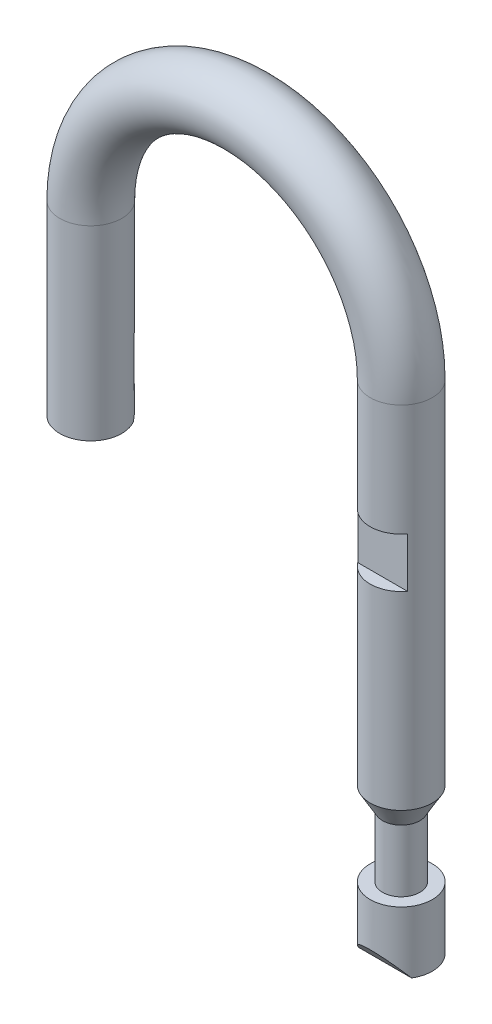
ISO-10303-21;
HEADER;
FILE_DESCRIPTION(('STEP AP214'),'2;1');
FILE_NAME('part.step','',(''),(''),'','','');
FILE_SCHEMA(('AUTOMOTIVE_DESIGN { 1 0 10303 214 1 1 1 1 }'));
ENDSEC;
DATA;
#1=APPLICATION_CONTEXT('core data for automotive mechanical design processes');
#2=APPLICATION_PROTOCOL_DEFINITION('international standard','automotive_design',2000,#1);
#3=PRODUCT_CONTEXT('',#1,'mechanical');
#4=PRODUCT('Part','Part','',(#3));
#5=PRODUCT_RELATED_PRODUCT_CATEGORY('part','',(#4));
#6=PRODUCT_DEFINITION_FORMATION('','',#4);
#7=PRODUCT_DEFINITION_CONTEXT('part definition',#1,'design');
#8=PRODUCT_DEFINITION('design','',#6,#7);
#9=PRODUCT_DEFINITION_SHAPE('','',#8);
#10=(LENGTH_UNIT() NAMED_UNIT(*) SI_UNIT(.MILLI.,.METRE.));
#11=(NAMED_UNIT(*) PLANE_ANGLE_UNIT() SI_UNIT($,.RADIAN.));
#12=(NAMED_UNIT(*) SI_UNIT($,.STERADIAN.) SOLID_ANGLE_UNIT());
#13=UNCERTAINTY_MEASURE_WITH_UNIT(LENGTH_MEASURE(1.E-05),#10,'distance_accuracy_value','');
#14=(GEOMETRIC_REPRESENTATION_CONTEXT(3) GLOBAL_UNCERTAINTY_ASSIGNED_CONTEXT((#13)) GLOBAL_UNIT_ASSIGNED_CONTEXT((#10,
#11,#12)) REPRESENTATION_CONTEXT('',''));
#15=CARTESIAN_POINT('',(0.,0.,0.));
#16=DIRECTION('',(0.,0.,1.));
#17=DIRECTION('',(1.,0.,0.));
#18=AXIS2_PLACEMENT_3D('',#15,#16,#17);
#19=CARTESIAN_POINT('',(32.5,5.,0.));
#20=DIRECTION('',(0.,-1.,0.));
#21=DIRECTION('',(1.,0.,0.));
#22=AXIS2_PLACEMENT_3D('',#19,#20,#21);
#23=CYLINDRICAL_SURFACE('',#22,2.5);
#24=CARTESIAN_POINT('',(32.5,-23.2679491924311,0.));
#25=DIRECTION('',(0.,-1.,0.));
#26=DIRECTION('',(0.,0.,-1.));
#27=AXIS2_PLACEMENT_3D('',#24,#25,#26);
#28=CIRCLE('',#27,2.5);
#29=CARTESIAN_POINT('',(32.5,-23.2679491924311,-2.5));
#30=VERTEX_POINT('',#29);
#31=EDGE_CURVE('E11',#30,#30,#28,.F.);
#32=ORIENTED_EDGE('',*,*,#31,.T.);
#33=EDGE_LOOP('',(#32));
#34=FACE_BOUND('',#33,.T.);
#35=DIRECTION('',(0.,-1.,0.));
#36=VECTOR('',#35,1.);
#37=CARTESIAN_POINT('',(34.5,5.,1.5));
#38=LINE('',#37,#36);
#39=CARTESIAN_POINT('',(34.5,-8.,1.5));
#40=VERTEX_POINT('',#39);
#41=CARTESIAN_POINT('',(34.5,-4.,1.5));
#42=VERTEX_POINT('',#41);
#43=EDGE_CURVE('E55',#40,#42,#38,.F.);
#44=ORIENTED_EDGE('',*,*,#43,.F.);
#45=CARTESIAN_POINT('',(32.5,-8.,0.));
#46=DIRECTION('',(0.,-1.,0.));
#47=DIRECTION('',(0.,0.,-1.));
#48=AXIS2_PLACEMENT_3D('',#45,#46,#47);
#49=CIRCLE('',#48,2.5);
#50=CARTESIAN_POINT('',(30.5,-8.,1.5));
#51=VERTEX_POINT('',#50);
#52=EDGE_CURVE('E146',#51,#40,#49,.F.);
#53=ORIENTED_EDGE('',*,*,#52,.F.);
#54=DIRECTION('',(0.,-1.,0.));
#55=VECTOR('',#54,1.);
#56=CARTESIAN_POINT('',(30.5,5.,1.5));
#57=LINE('',#56,#55);
#58=CARTESIAN_POINT('',(30.5,-4.,1.5));
#59=VERTEX_POINT('',#58);
#60=EDGE_CURVE('E107',#59,#51,#57,.T.);
#61=ORIENTED_EDGE('',*,*,#60,.F.);
#62=CARTESIAN_POINT('',(32.5,-4.00000000000001,0.));
#63=DIRECTION('',(0.,-1.,0.));
#64=DIRECTION('',(0.,0.,-1.));
#65=AXIS2_PLACEMENT_3D('',#62,#63,#64);
#66=CIRCLE('',#65,2.5);
#67=EDGE_CURVE('E149',#59,#42,#66,.F.);
#68=ORIENTED_EDGE('',*,*,#67,.T.);
#69=EDGE_LOOP('',(#44,#53,#61,#68));
#70=FACE_BOUND('',#69,.T.);
#71=CARTESIAN_POINT('',(32.5,5.,0.));
#72=DIRECTION('',(0.,-1.,0.));
#73=DIRECTION('',(0.,0.,1.));
#74=AXIS2_PLACEMENT_3D('',#71,#72,#73);
#75=CIRCLE('',#74,2.5);
#76=CARTESIAN_POINT('',(35.,5.,0.));
#77=VERTEX_POINT('',#76);
#78=EDGE_CURVE('E119',#77,#77,#75,.T.);
#79=ORIENTED_EDGE('',*,*,#78,.T.);
#80=EDGE_LOOP('',(#79));
#81=FACE_BOUND('',#80,.T.);
#82=ADVANCED_FACE('F45',(#34,#70,#81),#23,.T.);
#83=CARTESIAN_POINT('',(7.49999999999999,-10.,0.));
#84=DIRECTION('',(0.,1.,0.));
#85=DIRECTION('',(0.,0.,1.));
#86=AXIS2_PLACEMENT_3D('',#83,#84,#85);
#87=PLANE('',#86);
#88=DIRECTION('',(-1.,0.,0.));
#89=VECTOR('',#88,1.);
#90=CARTESIAN_POINT('',(10.,-10.,-1.3));
#91=LINE('',#90,#89);
#92=CARTESIAN_POINT('',(9.63541565040626,-10.,-1.3));
#93=VERTEX_POINT('',#92);
#94=CARTESIAN_POINT('',(5.36458434959373,-10.,-1.3));
#95=VERTEX_POINT('',#94);
#96=EDGE_CURVE('E169',#93,#95,#91,.T.);
#97=ORIENTED_EDGE('',*,*,#96,.F.);
#98=CARTESIAN_POINT('',(7.49999999999999,-10.,0.));
#99=DIRECTION('',(0.,1.,0.));
#100=DIRECTION('',(0.,0.,1.));
#101=AXIS2_PLACEMENT_3D('',#98,#99,#100);
#102=CIRCLE('',#101,2.5);
#103=EDGE_CURVE('E181',#95,#93,#102,.T.);
#104=ORIENTED_EDGE('',*,*,#103,.F.);
#105=EDGE_LOOP('',(#97,#104));
#106=FACE_BOUND('',#105,.T.);
#107=ADVANCED_FACE('F194',(#106),#87,.F.);
#108=CARTESIAN_POINT('',(7.49999999999999,-10.,0.));
#109=DIRECTION('',(0.,1.,0.));
#110=DIRECTION('',(-1.,0.,0.));
#111=AXIS2_PLACEMENT_3D('',#108,#109,#110);
#112=CYLINDRICAL_SURFACE('',#111,2.5);
#113=CARTESIAN_POINT('',(7.49999999999998,5.,0.));
#114=DIRECTION('',(0.,1.,0.));
#115=DIRECTION('',(0.,0.,1.));
#116=AXIS2_PLACEMENT_3D('',#113,#114,#115);
#117=CIRCLE('',#116,2.5);
#118=CARTESIAN_POINT('',(4.99999999999999,5.,0.));
#119=VERTEX_POINT('',#118);
#120=EDGE_CURVE('E126',#119,#119,#117,.T.);
#121=ORIENTED_EDGE('',*,*,#120,.F.);
#122=EDGE_LOOP('',(#121));
#123=FACE_BOUND('',#122,.T.);
#124=CARTESIAN_POINT('',(7.5,-11.625,0.));
#125=DIRECTION('',(0.,-0.624695047554424,-0.780868809443031));
#126=DIRECTION('',(0.,0.78086880944303,-0.624695047554424));
#127=AXIS2_PLACEMENT_3D('',#124,#125,#126);
#128=ELLIPSE('',#127,4.00195264839553,2.5);
#129=EDGE_CURVE('E118',#93,#95,#128,.F.);
#130=ORIENTED_EDGE('',*,*,#129,.T.);
#131=ORIENTED_EDGE('',*,*,#103,.T.);
#132=EDGE_LOOP('',(#130,#131));
#133=FACE_BOUND('',#132,.T.);
#134=CARTESIAN_POINT('',(7.49999999999999,-4.,0.));
#135=DIRECTION('',(0.,-1.,0.));
#136=DIRECTION('',(0.,0.,-1.));
#137=AXIS2_PLACEMENT_3D('',#134,#135,#136);
#138=CIRCLE('',#137,2.5);
#139=CARTESIAN_POINT('',(9.49999999999999,-4.,-1.5));
#140=VERTEX_POINT('',#139);
#141=CARTESIAN_POINT('',(5.49999999999999,-4.,-1.5));
#142=VERTEX_POINT('',#141);
#143=EDGE_CURVE('E133',#140,#142,#138,.F.);
#144=ORIENTED_EDGE('',*,*,#143,.T.);
#145=DIRECTION('',(0.,1.,0.));
#146=VECTOR('',#145,1.);
#147=CARTESIAN_POINT('',(5.5,-10.,-1.5));
#148=LINE('',#147,#146);
#149=CARTESIAN_POINT('',(5.49999999999999,-8.,-1.5));
#150=VERTEX_POINT('',#149);
#151=EDGE_CURVE('E108',#142,#150,#148,.F.);
#152=ORIENTED_EDGE('',*,*,#151,.T.);
#153=CARTESIAN_POINT('',(7.49999999999999,-8.,0.));
#154=DIRECTION('',(0.,1.,0.));
#155=DIRECTION('',(0.,0.,1.));
#156=AXIS2_PLACEMENT_3D('',#153,#154,#155);
#157=CIRCLE('',#156,2.5);
#158=CARTESIAN_POINT('',(9.49999999999999,-8.,-1.5));
#159=VERTEX_POINT('',#158);
#160=EDGE_CURVE('E137',#150,#159,#157,.F.);
#161=ORIENTED_EDGE('',*,*,#160,.T.);
#162=DIRECTION('',(0.,1.,0.));
#163=VECTOR('',#162,1.);
#164=CARTESIAN_POINT('',(9.49999999999999,-10.,-1.5));
#165=LINE('',#164,#163);
#166=EDGE_CURVE('E123',#159,#140,#165,.T.);
#167=ORIENTED_EDGE('',*,*,#166,.T.);
#168=EDGE_LOOP('',(#144,#152,#161,#167));
#169=FACE_BOUND('',#168,.T.);
#170=ADVANCED_FACE('F191',(#123,#133,#169),#112,.T.);
#171=CARTESIAN_POINT('',(20.,5.,0.));
#172=DIRECTION('',(0.,0.,-1.));
#173=DIRECTION('',(-1.,0.,0.));
#174=AXIS2_PLACEMENT_3D('',#171,#172,#173);
#175=TOROIDAL_SURFACE('',#174,12.5,2.5);
#176=CARTESIAN_POINT('',(20.,5.,0.));
#177=DIRECTION('',(0.,0.,-1.));
#178=DIRECTION('',(-1.,0.,0.));
#179=AXIS2_PLACEMENT_3D('',#176,#177,#178);
#180=CIRCLE('',#179,15.);
#181=EDGE_CURVE('',#119,#77,#180,.T.);
#182=ORIENTED_EDGE('',*,*,#120,.T.);
#183=ORIENTED_EDGE('',*,*,#78,.F.);
#184=ORIENTED_EDGE('',*,*,#181,.T.);
#185=ORIENTED_EDGE('',*,*,#181,.F.);
#186=EDGE_LOOP('',(#182,#184,#183,#185));
#187=FACE_BOUND('',#186,.T.);
#188=ADVANCED_FACE('F189',(#187),#175,.T.);
#189=CARTESIAN_POINT('',(10.,-4.53658536585366,-5.67073170731708));
#190=DIRECTION('',(0.,-0.624695047554424,-0.780868809443031));
#191=DIRECTION('',(0.,0.780868809443031,-0.624695047554424));
#192=AXIS2_PLACEMENT_3D('',#189,#190,#191);
#193=PLANE('',#192);
#194=ORIENTED_EDGE('',*,*,#129,.F.);
#195=ORIENTED_EDGE('',*,*,#96,.T.);
#196=EDGE_LOOP('',(#194,#195));
#197=FACE_BOUND('',#196,.T.);
#198=ADVANCED_FACE('F208',(#197),#193,.T.);
#199=CARTESIAN_POINT('',(10.,-8.,0.));
#200=DIRECTION('',(0.,1.,0.));
#201=DIRECTION('',(0.,0.,1.));
#202=AXIS2_PLACEMENT_3D('',#199,#200,#201);
#203=PLANE('',#202);
#204=DIRECTION('',(-1.,0.,0.));
#205=VECTOR('',#204,1.);
#206=CARTESIAN_POINT('',(10.,-8.,-1.5));
#207=LINE('',#206,#205);
#208=EDGE_CURVE('E173',#159,#150,#207,.T.);
#209=ORIENTED_EDGE('',*,*,#208,.F.);
#210=ORIENTED_EDGE('',*,*,#160,.F.);
#211=EDGE_LOOP('',(#209,#210));
#212=FACE_BOUND('',#211,.T.);
#213=ADVANCED_FACE('F201',(#212),#203,.T.);
#214=CARTESIAN_POINT('',(10.,-4.,0.));
#215=DIRECTION('',(0.,-1.,0.));
#216=DIRECTION('',(0.,0.,-1.));
#217=AXIS2_PLACEMENT_3D('',#214,#215,#216);
#218=PLANE('',#217);
#219=DIRECTION('',(-1.,0.,0.));
#220=VECTOR('',#219,1.);
#221=CARTESIAN_POINT('',(10.,-4.,-1.5));
#222=LINE('',#221,#220);
#223=EDGE_CURVE('E70',#140,#142,#222,.T.);
#224=ORIENTED_EDGE('',*,*,#223,.T.);
#225=ORIENTED_EDGE('',*,*,#143,.F.);
#226=EDGE_LOOP('',(#224,#225));
#227=FACE_BOUND('',#226,.T.);
#228=ADVANCED_FACE('F198',(#227),#218,.T.);
#229=CARTESIAN_POINT('',(10.,0.,-1.5));
#230=DIRECTION('',(0.,0.,-1.));
#231=DIRECTION('',(0.,1.,0.));
#232=AXIS2_PLACEMENT_3D('',#229,#230,#231);
#233=PLANE('',#232);
#234=ORIENTED_EDGE('',*,*,#223,.F.);
#235=ORIENTED_EDGE('',*,*,#166,.F.);
#236=ORIENTED_EDGE('',*,*,#208,.T.);
#237=ORIENTED_EDGE('',*,*,#151,.F.);
#238=EDGE_LOOP('',(#234,#235,#236,#237));
#239=FACE_BOUND('',#238,.T.);
#240=ADVANCED_FACE('F200',(#239),#233,.T.);
#241=CARTESIAN_POINT('',(35.,-4.,0.));
#242=DIRECTION('',(0.,-1.,0.));
#243=DIRECTION('',(0.,0.,-1.));
#244=AXIS2_PLACEMENT_3D('',#241,#242,#243);
#245=PLANE('',#244);
#246=DIRECTION('',(-1.,0.,0.));
#247=VECTOR('',#246,1.);
#248=CARTESIAN_POINT('',(35.,-4.,1.5));
#249=LINE('',#248,#247);
#250=EDGE_CURVE('E62',#42,#59,#249,.T.);
#251=ORIENTED_EDGE('',*,*,#250,.F.);
#252=ORIENTED_EDGE('',*,*,#67,.F.);
#253=EDGE_LOOP('',(#251,#252));
#254=FACE_BOUND('',#253,.T.);
#255=ADVANCED_FACE('F161',(#254),#245,.T.);
#256=CARTESIAN_POINT('',(35.,-8.,0.));
#257=DIRECTION('',(0.,-1.,0.));
#258=DIRECTION('',(0.,0.,-1.));
#259=AXIS2_PLACEMENT_3D('',#256,#257,#258);
#260=PLANE('',#259);
#261=ORIENTED_EDGE('',*,*,#52,.T.);
#262=DIRECTION('',(-1.,0.,0.));
#263=VECTOR('',#262,1.);
#264=CARTESIAN_POINT('',(35.,-8.,1.5));
#265=LINE('',#264,#263);
#266=EDGE_CURVE('E157',#40,#51,#265,.T.);
#267=ORIENTED_EDGE('',*,*,#266,.T.);
#268=EDGE_LOOP('',(#261,#267));
#269=FACE_BOUND('',#268,.T.);
#270=ADVANCED_FACE('F167',(#269),#260,.F.);
#271=CARTESIAN_POINT('',(35.,0.,1.5));
#272=DIRECTION('',(0.,0.,-1.));
#273=DIRECTION('',(0.,1.,0.));
#274=AXIS2_PLACEMENT_3D('',#271,#272,#273);
#275=PLANE('',#274);
#276=ORIENTED_EDGE('',*,*,#43,.T.);
#277=ORIENTED_EDGE('',*,*,#250,.T.);
#278=ORIENTED_EDGE('',*,*,#60,.T.);
#279=ORIENTED_EDGE('',*,*,#266,.F.);
#280=EDGE_LOOP('',(#276,#277,#278,#279));
#281=FACE_BOUND('',#280,.T.);
#282=ADVANCED_FACE('F155',(#281),#275,.F.);
#283=CARTESIAN_POINT('',(32.5,-30.,0.));
#284=DIRECTION('',(0.,-1.,0.));
#285=DIRECTION('',(1.,0.,0.));
#286=AXIS2_PLACEMENT_3D('',#283,#284,#285);
#287=PLANE('',#286);
#288=CARTESIAN_POINT('',(32.5,-30.,0.));
#289=DIRECTION('',(0.,-1.,0.));
#290=DIRECTION('',(1.,0.,0.));
#291=AXIS2_PLACEMENT_3D('',#288,#289,#290);
#292=CIRCLE('',#291,1.5);
#293=CARTESIAN_POINT('',(34.,-30.,0.));
#294=VERTEX_POINT('',#293);
#295=EDGE_CURVE('E235',#294,#294,#292,.T.);
#296=ORIENTED_EDGE('',*,*,#295,.T.);
#297=EDGE_LOOP('',(#296));
#298=FACE_BOUND('',#297,.T.);
#299=CARTESIAN_POINT('',(32.5,-30.,0.));
#300=DIRECTION('',(0.,-1.,0.));
#301=DIRECTION('',(1.,0.,0.));
#302=AXIS2_PLACEMENT_3D('',#299,#300,#301);
#303=CIRCLE('',#302,2.5);
#304=CARTESIAN_POINT('',(35.,-30.,0.));
#305=VERTEX_POINT('',#304);
#306=EDGE_CURVE('E114',#305,#305,#303,.T.);
#307=ORIENTED_EDGE('',*,*,#306,.F.);
#308=EDGE_LOOP('',(#307));
#309=FACE_BOUND('',#308,.T.);
#310=ADVANCED_FACE('F242',(#298,#309),#287,.F.);
#311=CARTESIAN_POINT('',(32.5,-25.,0.));
#312=DIRECTION('',(0.,-1.,0.));
#313=DIRECTION('',(1.,0.,0.));
#314=AXIS2_PLACEMENT_3D('',#311,#312,#313);
#315=CYLINDRICAL_SURFACE('',#314,1.5);
#316=CARTESIAN_POINT('',(32.5,-25.,0.));
#317=DIRECTION('',(0.,-1.,0.));
#318=DIRECTION('',(1.,0.,0.));
#319=AXIS2_PLACEMENT_3D('',#316,#317,#318);
#320=CIRCLE('',#319,1.5);
#321=CARTESIAN_POINT('',(34.,-25.,0.));
#322=VERTEX_POINT('',#321);
#323=EDGE_CURVE('E232',#322,#322,#320,.T.);
#324=ORIENTED_EDGE('',*,*,#323,.T.);
#325=EDGE_LOOP('',(#324));
#326=FACE_BOUND('',#325,.T.);
#327=ORIENTED_EDGE('',*,*,#295,.F.);
#328=EDGE_LOOP('',(#327));
#329=FACE_BOUND('',#328,.T.);
#330=ADVANCED_FACE('F244',(#326,#329),#315,.T.);
#331=CARTESIAN_POINT('',(32.5,-35.,0.));
#332=DIRECTION('',(0.,-1.,0.));
#333=DIRECTION('',(0.,0.,1.));
#334=AXIS2_PLACEMENT_3D('',#331,#332,#333);
#335=PLANE('',#334);
#336=DIRECTION('',(-1.,0.,0.));
#337=VECTOR('',#336,1.);
#338=CARTESIAN_POINT('',(35.,-35.,1.3));
#339=LINE('',#338,#337);
#340=CARTESIAN_POINT('',(34.6354156504063,-35.,1.3));
#341=VERTEX_POINT('',#340);
#342=CARTESIAN_POINT('',(30.3645843495937,-35.,1.3));
#343=VERTEX_POINT('',#342);
#344=EDGE_CURVE('E110',#341,#343,#339,.T.);
#345=ORIENTED_EDGE('',*,*,#344,.T.);
#346=CARTESIAN_POINT('',(32.5,-35.,0.));
#347=DIRECTION('',(0.,-1.,0.));
#348=DIRECTION('',(0.,0.,1.));
#349=AXIS2_PLACEMENT_3D('',#346,#347,#348);
#350=CIRCLE('',#349,2.5);
#351=EDGE_CURVE('E103',#343,#341,#350,.T.);
#352=ORIENTED_EDGE('',*,*,#351,.T.);
#353=EDGE_LOOP('',(#345,#352));
#354=FACE_BOUND('',#353,.T.);
#355=ADVANCED_FACE('F116',(#354),#335,.T.);
#356=CARTESIAN_POINT('',(35.,-14.2926829268292,17.8658536585366));
#357=DIRECTION('',(0.,0.624695047554424,-0.780868809443031));
#358=DIRECTION('',(0.,0.780868809443031,0.624695047554424));
#359=AXIS2_PLACEMENT_3D('',#356,#357,#358);
#360=PLANE('',#359);
#361=ORIENTED_EDGE('',*,*,#344,.F.);
#362=CARTESIAN_POINT('',(32.5,-36.625,0.));
#363=DIRECTION('',(0.,0.624695047554424,-0.780868809443031));
#364=DIRECTION('',(0.,-0.780868809443031,-0.624695047554424));
#365=AXIS2_PLACEMENT_3D('',#362,#363,#364);
#366=ELLIPSE('',#365,4.00195264839553,2.5);
#367=EDGE_CURVE('E99',#341,#343,#366,.F.);
#368=ORIENTED_EDGE('',*,*,#367,.T.);
#369=EDGE_LOOP('',(#361,#368));
#370=FACE_BOUND('',#369,.T.);
#371=ADVANCED_FACE('F111',(#370),#360,.F.);
#372=ORIENTED_EDGE('',*,*,#306,.T.);
#373=EDGE_LOOP('',(#372));
#374=FACE_BOUND('',#373,.T.);
#375=ORIENTED_EDGE('',*,*,#367,.F.);
#376=ORIENTED_EDGE('',*,*,#351,.F.);
#377=EDGE_LOOP('',(#375,#376));
#378=FACE_BOUND('',#377,.T.);
#379=ADVANCED_FACE('F101',(#374,#378),#23,.T.);
#380=CARTESIAN_POINT('',(32.5,-25.,0.));
#381=DIRECTION('',(0.,1.,0.));
#382=DIRECTION('',(0.,0.,1.));
#383=AXIS2_PLACEMENT_3D('',#380,#381,#382);
#384=CONICAL_SURFACE('',#383,1.5,0.5235987755983);
#385=ORIENTED_EDGE('',*,*,#31,.F.);
#386=EDGE_LOOP('',(#385));
#387=FACE_BOUND('',#386,.T.);
#388=ORIENTED_EDGE('',*,*,#323,.F.);
#389=EDGE_LOOP('',(#388));
#390=FACE_BOUND('',#389,.T.);
#391=ADVANCED_FACE('F48',(#387,#390),#384,.T.);
#392=CLOSED_SHELL('',(#82,#107,#170,#188,#198,#213,#228,#240,#255,#270,#282,#310,#330,#355,#371,
#379,#391));
#393=MANIFOLD_SOLID_BREP('B2',#392);
#394=ADVANCED_BREP_SHAPE_REPRESENTATION('',(#18,#393),#14);
#395=SHAPE_DEFINITION_REPRESENTATION(#9,#394);
ENDSEC;
END-ISO-10303-21;
